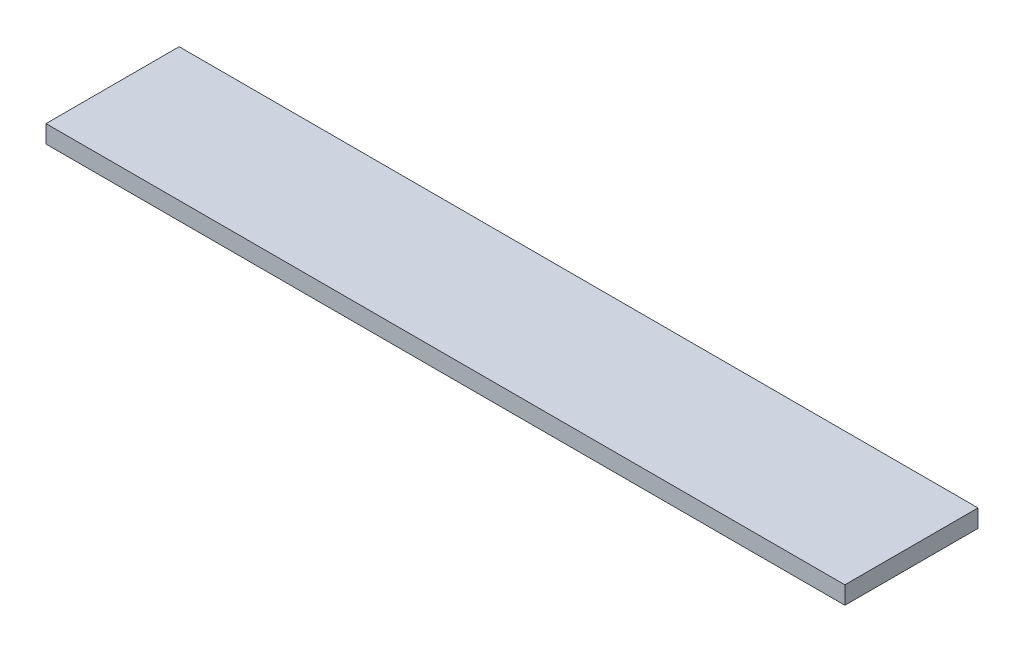
ISO-10303-21;
HEADER;
FILE_DESCRIPTION(('STEP AP214'),'2;1');
FILE_NAME('part.step','',(''),(''),'','','');
FILE_SCHEMA(('AUTOMOTIVE_DESIGN { 1 0 10303 214 1 1 1 1 }'));
ENDSEC;
DATA;
#1=APPLICATION_CONTEXT('core data for automotive mechanical design processes');
#2=APPLICATION_PROTOCOL_DEFINITION('international standard','automotive_design',2000,#1);
#3=PRODUCT_CONTEXT('',#1,'mechanical');
#4=PRODUCT('Part','Part','',(#3));
#5=PRODUCT_RELATED_PRODUCT_CATEGORY('part','',(#4));
#6=PRODUCT_DEFINITION_FORMATION('','',#4);
#7=PRODUCT_DEFINITION_CONTEXT('part definition',#1,'design');
#8=PRODUCT_DEFINITION('design','',#6,#7);
#9=PRODUCT_DEFINITION_SHAPE('','',#8);
#10=(LENGTH_UNIT() NAMED_UNIT(*) SI_UNIT(.MILLI.,.METRE.));
#11=(NAMED_UNIT(*) PLANE_ANGLE_UNIT() SI_UNIT($,.RADIAN.));
#12=(NAMED_UNIT(*) SI_UNIT($,.STERADIAN.) SOLID_ANGLE_UNIT());
#13=UNCERTAINTY_MEASURE_WITH_UNIT(LENGTH_MEASURE(1.E-05),#10,'distance_accuracy_value','');
#14=(GEOMETRIC_REPRESENTATION_CONTEXT(3) GLOBAL_UNCERTAINTY_ASSIGNED_CONTEXT((#13)) GLOBAL_UNIT_ASSIGNED_CONTEXT((#10,
#11,#12)) REPRESENTATION_CONTEXT('',''));
#15=CARTESIAN_POINT('',(0.,0.,0.));
#16=DIRECTION('',(0.,0.,1.));
#17=DIRECTION('',(1.,0.,0.));
#18=AXIS2_PLACEMENT_3D('',#15,#16,#17);
#19=CARTESIAN_POINT('',(90.,1.,-7.5));
#20=DIRECTION('',(0.,0.,1.));
#21=DIRECTION('',(0.,-1.,0.));
#22=AXIS2_PLACEMENT_3D('',#19,#20,#21);
#23=PLANE('',#22);
#24=DIRECTION('',(0.,1.,0.));
#25=VECTOR('',#24,1.);
#26=CARTESIAN_POINT('',(0.,1.,-7.5));
#27=LINE('',#26,#25);
#28=CARTESIAN_POINT('',(0.,-1.,-7.5));
#29=VERTEX_POINT('',#28);
#30=CARTESIAN_POINT('',(0.,1.,-7.5));
#31=VERTEX_POINT('',#30);
#32=EDGE_CURVE('E111',#29,#31,#27,.T.);
#33=ORIENTED_EDGE('',*,*,#32,.T.);
#34=DIRECTION('',(-1.,0.,0.));
#35=VECTOR('',#34,1.);
#36=CARTESIAN_POINT('',(90.,1.,-7.5));
#37=LINE('',#36,#35);
#38=CARTESIAN_POINT('',(90.,1.,-7.5));
#39=VERTEX_POINT('',#38);
#40=EDGE_CURVE('E11',#39,#31,#37,.T.);
#41=ORIENTED_EDGE('',*,*,#40,.F.);
#42=DIRECTION('',(0.,1.,0.));
#43=VECTOR('',#42,1.);
#44=CARTESIAN_POINT('',(90.,1.,-7.5));
#45=LINE('',#44,#43);
#46=CARTESIAN_POINT('',(90.,-1.,-7.5));
#47=VERTEX_POINT('',#46);
#48=EDGE_CURVE('E95',#47,#39,#45,.T.);
#49=ORIENTED_EDGE('',*,*,#48,.F.);
#50=DIRECTION('',(-1.,0.,0.));
#51=VECTOR('',#50,1.);
#52=CARTESIAN_POINT('',(90.,-1.,-7.5));
#53=LINE('',#52,#51);
#54=EDGE_CURVE('E107',#47,#29,#53,.T.);
#55=ORIENTED_EDGE('',*,*,#54,.T.);
#56=EDGE_LOOP('',(#33,#41,#49,#55));
#57=FACE_BOUND('',#56,.T.);
#58=ADVANCED_FACE('F43',(#57),#23,.F.);
#59=CARTESIAN_POINT('',(90.,1.,7.5));
#60=DIRECTION('',(0.,-1.,0.));
#61=DIRECTION('',(0.,0.,-1.));
#62=AXIS2_PLACEMENT_3D('',#59,#60,#61);
#63=PLANE('',#62);
#64=DIRECTION('',(0.,0.,1.));
#65=VECTOR('',#64,1.);
#66=CARTESIAN_POINT('',(0.,1.,7.5));
#67=LINE('',#66,#65);
#68=CARTESIAN_POINT('',(0.,1.,7.5));
#69=VERTEX_POINT('',#68);
#70=EDGE_CURVE('E100',#31,#69,#67,.T.);
#71=ORIENTED_EDGE('',*,*,#70,.T.);
#72=DIRECTION('',(-1.,0.,0.));
#73=VECTOR('',#72,1.);
#74=CARTESIAN_POINT('',(90.,1.,7.5));
#75=LINE('',#74,#73);
#76=CARTESIAN_POINT('',(90.,1.,7.5));
#77=VERTEX_POINT('',#76);
#78=EDGE_CURVE('E52',#77,#69,#75,.T.);
#79=ORIENTED_EDGE('',*,*,#78,.F.);
#80=DIRECTION('',(0.,0.,1.));
#81=VECTOR('',#80,1.);
#82=CARTESIAN_POINT('',(90.,1.,7.5));
#83=LINE('',#82,#81);
#84=EDGE_CURVE('E90',#39,#77,#83,.T.);
#85=ORIENTED_EDGE('',*,*,#84,.F.);
#86=ORIENTED_EDGE('',*,*,#40,.T.);
#87=EDGE_LOOP('',(#71,#79,#85,#86));
#88=FACE_BOUND('',#87,.T.);
#89=ADVANCED_FACE('F99',(#88),#63,.F.);
#90=CARTESIAN_POINT('',(90.,1.,7.5));
#91=DIRECTION('',(0.,0.,-1.));
#92=DIRECTION('',(-1.,0.,0.));
#93=AXIS2_PLACEMENT_3D('',#90,#91,#92);
#94=PLANE('',#93);
#95=DIRECTION('',(0.,-1.,0.));
#96=VECTOR('',#95,1.);
#97=CARTESIAN_POINT('',(0.,1.,7.5));
#98=LINE('',#97,#96);
#99=CARTESIAN_POINT('',(0.,-1.,7.5));
#100=VERTEX_POINT('',#99);
#101=EDGE_CURVE('E77',#69,#100,#98,.T.);
#102=ORIENTED_EDGE('',*,*,#101,.T.);
#103=DIRECTION('',(-1.,0.,0.));
#104=VECTOR('',#103,1.);
#105=CARTESIAN_POINT('',(90.,-1.,7.5));
#106=LINE('',#105,#104);
#107=CARTESIAN_POINT('',(90.,-1.,7.5));
#108=VERTEX_POINT('',#107);
#109=EDGE_CURVE('E102',#108,#100,#106,.T.);
#110=ORIENTED_EDGE('',*,*,#109,.F.);
#111=DIRECTION('',(0.,-1.,0.));
#112=VECTOR('',#111,1.);
#113=CARTESIAN_POINT('',(90.,1.,7.5));
#114=LINE('',#113,#112);
#115=EDGE_CURVE('E93',#77,#108,#114,.T.);
#116=ORIENTED_EDGE('',*,*,#115,.F.);
#117=ORIENTED_EDGE('',*,*,#78,.T.);
#118=EDGE_LOOP('',(#102,#110,#116,#117));
#119=FACE_BOUND('',#118,.T.);
#120=ADVANCED_FACE('F103',(#119),#94,.F.);
#121=CARTESIAN_POINT('',(90.,-1.,7.5));
#122=DIRECTION('',(0.,1.,0.));
#123=DIRECTION('',(0.,0.,1.));
#124=AXIS2_PLACEMENT_3D('',#121,#122,#123);
#125=PLANE('',#124);
#126=DIRECTION('',(0.,0.,-1.));
#127=VECTOR('',#126,1.);
#128=CARTESIAN_POINT('',(0.,-1.,7.5));
#129=LINE('',#128,#127);
#130=EDGE_CURVE('E83',#100,#29,#129,.T.);
#131=ORIENTED_EDGE('',*,*,#130,.T.);
#132=ORIENTED_EDGE('',*,*,#54,.F.);
#133=DIRECTION('',(0.,0.,-1.));
#134=VECTOR('',#133,1.);
#135=CARTESIAN_POINT('',(90.,-1.,7.5));
#136=LINE('',#135,#134);
#137=EDGE_CURVE('E60',#108,#47,#136,.T.);
#138=ORIENTED_EDGE('',*,*,#137,.F.);
#139=ORIENTED_EDGE('',*,*,#109,.T.);
#140=EDGE_LOOP('',(#131,#132,#138,#139));
#141=FACE_BOUND('',#140,.T.);
#142=ADVANCED_FACE('F124',(#141),#125,.F.);
#143=CARTESIAN_POINT('',(90.,0.,0.));
#144=DIRECTION('',(1.,0.,0.));
#145=DIRECTION('',(0.,0.,-1.));
#146=AXIS2_PLACEMENT_3D('',#143,#144,#145);
#147=PLANE('',#146);
#148=ORIENTED_EDGE('',*,*,#48,.T.);
#149=ORIENTED_EDGE('',*,*,#84,.T.);
#150=ORIENTED_EDGE('',*,*,#115,.T.);
#151=ORIENTED_EDGE('',*,*,#137,.T.);
#152=EDGE_LOOP('',(#148,#149,#150,#151));
#153=FACE_BOUND('',#152,.T.);
#154=ADVANCED_FACE('F91',(#153),#147,.T.);
#155=CARTESIAN_POINT('',(0.,0.,0.));
#156=DIRECTION('',(1.,0.,0.));
#157=DIRECTION('',(0.,0.,-1.));
#158=AXIS2_PLACEMENT_3D('',#155,#156,#157);
#159=PLANE('',#158);
#160=ORIENTED_EDGE('',*,*,#32,.F.);
#161=ORIENTED_EDGE('',*,*,#130,.F.);
#162=ORIENTED_EDGE('',*,*,#101,.F.);
#163=ORIENTED_EDGE('',*,*,#70,.F.);
#164=EDGE_LOOP('',(#160,#161,#162,#163));
#165=FACE_BOUND('',#164,.T.);
#166=ADVANCED_FACE('F127',(#165),#159,.F.);
#167=CLOSED_SHELL('',(#58,#89,#120,#142,#154,#166));
#168=MANIFOLD_SOLID_BREP('B2',#167);
#169=ADVANCED_BREP_SHAPE_REPRESENTATION('',(#18,#168),#14);
#170=SHAPE_DEFINITION_REPRESENTATION(#9,#169);
ENDSEC;
END-ISO-10303-21;
